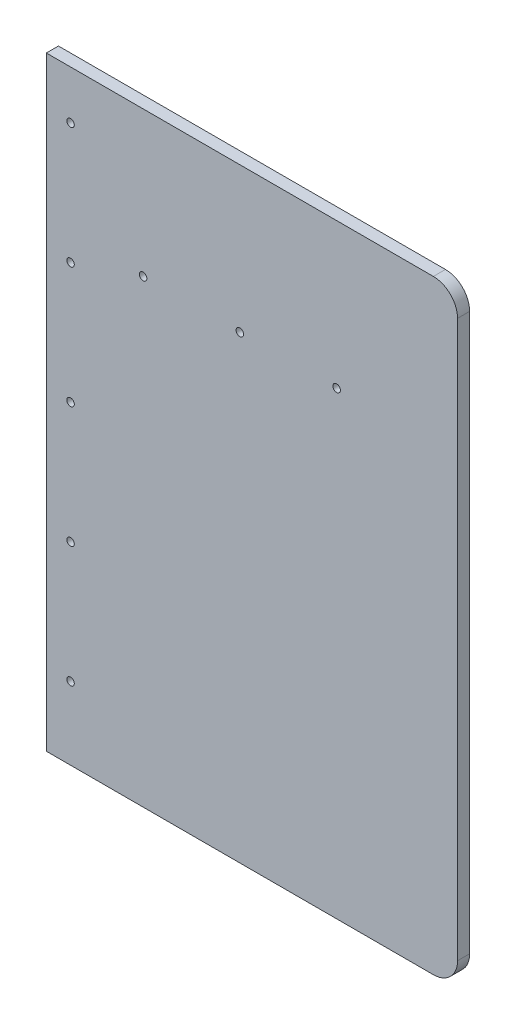
ISO-10303-21;
HEADER;
FILE_DESCRIPTION(('STEP AP214'),'2;1');
FILE_NAME('part.step','',(''),(''),'','','');
FILE_SCHEMA(('AUTOMOTIVE_DESIGN { 1 0 10303 214 1 1 1 1 }'));
ENDSEC;
DATA;
#1=APPLICATION_CONTEXT('core data for automotive mechanical design processes');
#2=APPLICATION_PROTOCOL_DEFINITION('international standard','automotive_design',2000,#1);
#3=PRODUCT_CONTEXT('',#1,'mechanical');
#4=PRODUCT('Part','Part','',(#3));
#5=PRODUCT_RELATED_PRODUCT_CATEGORY('part','',(#4));
#6=PRODUCT_DEFINITION_FORMATION('','',#4);
#7=PRODUCT_DEFINITION_CONTEXT('part definition',#1,'design');
#8=PRODUCT_DEFINITION('design','',#6,#7);
#9=PRODUCT_DEFINITION_SHAPE('','',#8);
#10=(LENGTH_UNIT() NAMED_UNIT(*) SI_UNIT(.MILLI.,.METRE.));
#11=(NAMED_UNIT(*) PLANE_ANGLE_UNIT() SI_UNIT($,.RADIAN.));
#12=(NAMED_UNIT(*) SI_UNIT($,.STERADIAN.) SOLID_ANGLE_UNIT());
#13=UNCERTAINTY_MEASURE_WITH_UNIT(LENGTH_MEASURE(1.E-05),#10,'distance_accuracy_value','');
#14=(GEOMETRIC_REPRESENTATION_CONTEXT(3) GLOBAL_UNCERTAINTY_ASSIGNED_CONTEXT((#13)) GLOBAL_UNIT_ASSIGNED_CONTEXT((#10,
#11,#12)) REPRESENTATION_CONTEXT('',''));
#15=CARTESIAN_POINT('',(0.,0.,0.));
#16=DIRECTION('',(0.,0.,1.));
#17=DIRECTION('',(1.,0.,0.));
#18=AXIS2_PLACEMENT_3D('',#15,#16,#17);
#19=CARTESIAN_POINT('',(75.,-115.,5.));
#20=DIRECTION('',(0.,0.,1.));
#21=DIRECTION('',(1.,0.,0.));
#22=AXIS2_PLACEMENT_3D('',#19,#20,#21);
#23=PLANE('',#22);
#24=CARTESIAN_POINT('',(-5.00000000000002,64.9999999999991,5.));
#25=DIRECTION('',(0.,0.,1.));
#26=DIRECTION('',(1.,0.,0.));
#27=AXIS2_PLACEMENT_3D('',#24,#25,#26);
#28=CIRCLE('',#27,1.55);
#29=CARTESIAN_POINT('',(-3.45000000000002,64.9999999999991,5.));
#30=VERTEX_POINT('',#29);
#31=EDGE_CURVE('E206',#30,#30,#28,.T.);
#32=ORIENTED_EDGE('',*,*,#31,.F.);
#33=EDGE_LOOP('',(#32));
#34=FACE_BOUND('',#33,.T.);
#35=CARTESIAN_POINT('',(-74.9999999999985,-45.,5.));
#36=DIRECTION('',(0.,0.,1.));
#37=DIRECTION('',(1.,0.,0.));
#38=AXIS2_PLACEMENT_3D('',#35,#36,#37);
#39=CIRCLE('',#38,1.54999999999999);
#40=CARTESIAN_POINT('',(-73.4499999999985,-45.,5.));
#41=VERTEX_POINT('',#40);
#42=EDGE_CURVE('E218',#41,#41,#39,.T.);
#43=ORIENTED_EDGE('',*,*,#42,.F.);
#44=EDGE_LOOP('',(#43));
#45=FACE_BOUND('',#44,.T.);
#46=CARTESIAN_POINT('',(-74.9999999999995,55.,5.));
#47=DIRECTION('',(0.,0.,1.));
#48=DIRECTION('',(1.,0.,0.));
#49=AXIS2_PLACEMENT_3D('',#46,#47,#48);
#50=CIRCLE('',#49,1.54999999999999);
#51=CARTESIAN_POINT('',(-73.4499999999995,55.,5.));
#52=VERTEX_POINT('',#51);
#53=EDGE_CURVE('E230',#52,#52,#50,.T.);
#54=ORIENTED_EDGE('',*,*,#53,.F.);
#55=EDGE_LOOP('',(#54));
#56=FACE_BOUND('',#55,.T.);
#57=CARTESIAN_POINT('',(35.,64.9999999999999,5.));
#58=DIRECTION('',(0.,0.,1.));
#59=DIRECTION('',(1.,0.,0.));
#60=AXIS2_PLACEMENT_3D('',#57,#58,#59);
#61=CIRCLE('',#60,1.54999999999999);
#62=CARTESIAN_POINT('',(36.55,64.9999999999999,5.));
#63=VERTEX_POINT('',#62);
#64=EDGE_CURVE('E123',#63,#63,#61,.T.);
#65=ORIENTED_EDGE('',*,*,#64,.F.);
#66=EDGE_LOOP('',(#65));
#67=FACE_BOUND('',#66,.T.);
#68=DIRECTION('',(0.,-1.,0.));
#69=VECTOR('',#68,1.);
#70=CARTESIAN_POINT('',(-85.,125.,5.));
#71=LINE('',#70,#69);
#72=CARTESIAN_POINT('',(-85.,125.,5.));
#73=VERTEX_POINT('',#72);
#74=CARTESIAN_POINT('',(-85.,-125.,5.));
#75=VERTEX_POINT('',#74);
#76=EDGE_CURVE('E130',#73,#75,#71,.T.);
#77=ORIENTED_EDGE('',*,*,#76,.T.);
#78=DIRECTION('',(1.,0.,0.));
#79=VECTOR('',#78,1.);
#80=CARTESIAN_POINT('',(75.,-125.,5.));
#81=LINE('',#80,#79);
#82=CARTESIAN_POINT('',(75.,-125.,5.));
#83=VERTEX_POINT('',#82);
#84=EDGE_CURVE('E88',#75,#83,#81,.T.);
#85=ORIENTED_EDGE('',*,*,#84,.T.);
#86=CARTESIAN_POINT('',(75.,-115.,5.));
#87=DIRECTION('',(0.,0.,1.));
#88=DIRECTION('',(1.,0.,0.));
#89=AXIS2_PLACEMENT_3D('',#86,#87,#88);
#90=CIRCLE('',#89,9.99999999999999);
#91=CARTESIAN_POINT('',(85.,-115.,5.));
#92=VERTEX_POINT('',#91);
#93=EDGE_CURVE('E101',#83,#92,#90,.T.);
#94=ORIENTED_EDGE('',*,*,#93,.T.);
#95=DIRECTION('',(0.,1.,0.));
#96=VECTOR('',#95,1.);
#97=CARTESIAN_POINT('',(85.,115.,5.));
#98=LINE('',#97,#96);
#99=CARTESIAN_POINT('',(85.,115.,5.));
#100=VERTEX_POINT('',#99);
#101=EDGE_CURVE('E95',#92,#100,#98,.T.);
#102=ORIENTED_EDGE('',*,*,#101,.T.);
#103=CARTESIAN_POINT('',(75.,115.,5.));
#104=DIRECTION('',(0.,0.,1.));
#105=DIRECTION('',(1.,0.,0.));
#106=AXIS2_PLACEMENT_3D('',#103,#104,#105);
#107=CIRCLE('',#106,9.99999999999999);
#108=CARTESIAN_POINT('',(75.,125.,5.));
#109=VERTEX_POINT('',#108);
#110=EDGE_CURVE('E99',#100,#109,#107,.T.);
#111=ORIENTED_EDGE('',*,*,#110,.T.);
#112=DIRECTION('',(-1.,0.,0.));
#113=VECTOR('',#112,1.);
#114=CARTESIAN_POINT('',(75.,125.,5.));
#115=LINE('',#114,#113);
#116=EDGE_CURVE('E51',#109,#73,#115,.T.);
#117=ORIENTED_EDGE('',*,*,#116,.T.);
#118=EDGE_LOOP('',(#77,#85,#94,#102,#111,#117));
#119=FACE_BOUND('',#118,.T.);
#120=CARTESIAN_POINT('',(-75.,105.,5.));
#121=DIRECTION('',(0.,0.,1.));
#122=DIRECTION('',(1.,0.,0.));
#123=AXIS2_PLACEMENT_3D('',#120,#121,#122);
#124=CIRCLE('',#123,1.54999999999999);
#125=CARTESIAN_POINT('',(-73.45,105.,5.));
#126=VERTEX_POINT('',#125);
#127=EDGE_CURVE('E236',#126,#126,#124,.T.);
#128=ORIENTED_EDGE('',*,*,#127,.F.);
#129=EDGE_LOOP('',(#128));
#130=FACE_BOUND('',#129,.T.);
#131=CARTESIAN_POINT('',(-74.999999999999,4.99999999999996,5.));
#132=DIRECTION('',(0.,0.,1.));
#133=DIRECTION('',(1.,0.,0.));
#134=AXIS2_PLACEMENT_3D('',#131,#132,#133);
#135=CIRCLE('',#134,1.54999999999999);
#136=CARTESIAN_POINT('',(-73.449999999999,4.99999999999996,5.));
#137=VERTEX_POINT('',#136);
#138=EDGE_CURVE('E224',#137,#137,#135,.T.);
#139=ORIENTED_EDGE('',*,*,#138,.F.);
#140=EDGE_LOOP('',(#139));
#141=FACE_BOUND('',#140,.T.);
#142=CARTESIAN_POINT('',(-74.9999999999979,-95.,5.));
#143=DIRECTION('',(0.,0.,1.));
#144=DIRECTION('',(1.,0.,0.));
#145=AXIS2_PLACEMENT_3D('',#142,#143,#144);
#146=CIRCLE('',#145,1.54999999999999);
#147=CARTESIAN_POINT('',(-73.4499999999979,-95.,5.));
#148=VERTEX_POINT('',#147);
#149=EDGE_CURVE('E212',#148,#148,#146,.T.);
#150=ORIENTED_EDGE('',*,*,#149,.F.);
#151=EDGE_LOOP('',(#150));
#152=FACE_BOUND('',#151,.T.);
#153=CARTESIAN_POINT('',(-45.,64.9999999999983,5.));
#154=DIRECTION('',(0.,0.,1.));
#155=DIRECTION('',(1.,0.,0.));
#156=AXIS2_PLACEMENT_3D('',#153,#154,#155);
#157=CIRCLE('',#156,1.54999999999999);
#158=CARTESIAN_POINT('',(-43.45,64.9999999999983,5.));
#159=VERTEX_POINT('',#158);
#160=EDGE_CURVE('E197',#159,#159,#157,.T.);
#161=ORIENTED_EDGE('',*,*,#160,.F.);
#162=EDGE_LOOP('',(#161));
#163=FACE_BOUND('',#162,.T.);
#164=ADVANCED_FACE('F34',(#34,#45,#56,#67,#119,#130,#141,#152,#163),#23,.T.);
#165=CARTESIAN_POINT('',(75.,-115.,0.));
#166=DIRECTION('',(0.,0.,1.));
#167=DIRECTION('',(1.,0.,0.));
#168=AXIS2_PLACEMENT_3D('',#165,#166,#167);
#169=PLANE('',#168);
#170=DIRECTION('',(0.,-1.,0.));
#171=VECTOR('',#170,1.);
#172=CARTESIAN_POINT('',(-85.,125.,0.));
#173=LINE('',#172,#171);
#174=CARTESIAN_POINT('',(-85.,125.,0.));
#175=VERTEX_POINT('',#174);
#176=CARTESIAN_POINT('',(-85.,-125.,0.));
#177=VERTEX_POINT('',#176);
#178=EDGE_CURVE('E119',#175,#177,#173,.T.);
#179=ORIENTED_EDGE('',*,*,#178,.F.);
#180=DIRECTION('',(-1.,0.,0.));
#181=VECTOR('',#180,1.);
#182=CARTESIAN_POINT('',(75.,125.,0.));
#183=LINE('',#182,#181);
#184=CARTESIAN_POINT('',(75.,125.,0.));
#185=VERTEX_POINT('',#184);
#186=EDGE_CURVE('E80',#185,#175,#183,.T.);
#187=ORIENTED_EDGE('',*,*,#186,.F.);
#188=CARTESIAN_POINT('',(75.,115.,0.));
#189=DIRECTION('',(0.,0.,1.));
#190=DIRECTION('',(1.,0.,0.));
#191=AXIS2_PLACEMENT_3D('',#188,#189,#190);
#192=CIRCLE('',#191,9.99999999999999);
#193=CARTESIAN_POINT('',(85.,115.,0.));
#194=VERTEX_POINT('',#193);
#195=EDGE_CURVE('E74',#194,#185,#192,.T.);
#196=ORIENTED_EDGE('',*,*,#195,.F.);
#197=DIRECTION('',(0.,1.,0.));
#198=VECTOR('',#197,1.);
#199=CARTESIAN_POINT('',(85.,115.,0.));
#200=LINE('',#199,#198);
#201=CARTESIAN_POINT('',(85.,-115.,0.));
#202=VERTEX_POINT('',#201);
#203=EDGE_CURVE('E109',#202,#194,#200,.T.);
#204=ORIENTED_EDGE('',*,*,#203,.F.);
#205=CARTESIAN_POINT('',(75.,-115.,0.));
#206=DIRECTION('',(0.,0.,1.));
#207=DIRECTION('',(1.,0.,0.));
#208=AXIS2_PLACEMENT_3D('',#205,#206,#207);
#209=CIRCLE('',#208,9.99999999999999);
#210=CARTESIAN_POINT('',(75.,-125.,0.));
#211=VERTEX_POINT('',#210);
#212=EDGE_CURVE('E125',#211,#202,#209,.T.);
#213=ORIENTED_EDGE('',*,*,#212,.F.);
#214=DIRECTION('',(1.,0.,0.));
#215=VECTOR('',#214,1.);
#216=CARTESIAN_POINT('',(75.,-125.,0.));
#217=LINE('',#216,#215);
#218=EDGE_CURVE('E122',#177,#211,#217,.T.);
#219=ORIENTED_EDGE('',*,*,#218,.F.);
#220=EDGE_LOOP('',(#179,#187,#196,#204,#213,#219));
#221=FACE_BOUND('',#220,.T.);
#222=CARTESIAN_POINT('',(35.,64.9999999999999,0.));
#223=DIRECTION('',(0.,0.,1.));
#224=DIRECTION('',(1.,0.,0.));
#225=AXIS2_PLACEMENT_3D('',#222,#223,#224);
#226=CIRCLE('',#225,1.54999999999999);
#227=CARTESIAN_POINT('',(36.55,64.9999999999999,0.));
#228=VERTEX_POINT('',#227);
#229=EDGE_CURVE('E239',#228,#228,#226,.T.);
#230=ORIENTED_EDGE('',*,*,#229,.T.);
#231=EDGE_LOOP('',(#230));
#232=FACE_BOUND('',#231,.T.);
#233=CARTESIAN_POINT('',(-75.,105.,0.));
#234=DIRECTION('',(0.,0.,1.));
#235=DIRECTION('',(1.,0.,0.));
#236=AXIS2_PLACEMENT_3D('',#233,#234,#235);
#237=CIRCLE('',#236,1.54999999999999);
#238=CARTESIAN_POINT('',(-73.45,105.,0.));
#239=VERTEX_POINT('',#238);
#240=EDGE_CURVE('E233',#239,#239,#237,.T.);
#241=ORIENTED_EDGE('',*,*,#240,.T.);
#242=EDGE_LOOP('',(#241));
#243=FACE_BOUND('',#242,.T.);
#244=CARTESIAN_POINT('',(-74.9999999999995,55.,0.));
#245=DIRECTION('',(0.,0.,1.));
#246=DIRECTION('',(1.,0.,0.));
#247=AXIS2_PLACEMENT_3D('',#244,#245,#246);
#248=CIRCLE('',#247,1.54999999999999);
#249=CARTESIAN_POINT('',(-73.4499999999995,55.,0.));
#250=VERTEX_POINT('',#249);
#251=EDGE_CURVE('E227',#250,#250,#248,.T.);
#252=ORIENTED_EDGE('',*,*,#251,.T.);
#253=EDGE_LOOP('',(#252));
#254=FACE_BOUND('',#253,.T.);
#255=CARTESIAN_POINT('',(-74.999999999999,4.99999999999996,0.));
#256=DIRECTION('',(0.,0.,1.));
#257=DIRECTION('',(1.,0.,0.));
#258=AXIS2_PLACEMENT_3D('',#255,#256,#257);
#259=CIRCLE('',#258,1.54999999999999);
#260=CARTESIAN_POINT('',(-73.449999999999,4.99999999999996,0.));
#261=VERTEX_POINT('',#260);
#262=EDGE_CURVE('E221',#261,#261,#259,.T.);
#263=ORIENTED_EDGE('',*,*,#262,.T.);
#264=EDGE_LOOP('',(#263));
#265=FACE_BOUND('',#264,.T.);
#266=CARTESIAN_POINT('',(-74.9999999999985,-45.,0.));
#267=DIRECTION('',(0.,0.,1.));
#268=DIRECTION('',(1.,0.,0.));
#269=AXIS2_PLACEMENT_3D('',#266,#267,#268);
#270=CIRCLE('',#269,1.54999999999999);
#271=CARTESIAN_POINT('',(-73.4499999999985,-45.,0.));
#272=VERTEX_POINT('',#271);
#273=EDGE_CURVE('E215',#272,#272,#270,.T.);
#274=ORIENTED_EDGE('',*,*,#273,.T.);
#275=EDGE_LOOP('',(#274));
#276=FACE_BOUND('',#275,.T.);
#277=CARTESIAN_POINT('',(-74.9999999999979,-95.,0.));
#278=DIRECTION('',(0.,0.,1.));
#279=DIRECTION('',(1.,0.,0.));
#280=AXIS2_PLACEMENT_3D('',#277,#278,#279);
#281=CIRCLE('',#280,1.54999999999999);
#282=CARTESIAN_POINT('',(-73.4499999999979,-95.,0.));
#283=VERTEX_POINT('',#282);
#284=EDGE_CURVE('E209',#283,#283,#281,.T.);
#285=ORIENTED_EDGE('',*,*,#284,.T.);
#286=EDGE_LOOP('',(#285));
#287=FACE_BOUND('',#286,.T.);
#288=CARTESIAN_POINT('',(-5.00000000000002,64.9999999999991,0.));
#289=DIRECTION('',(0.,0.,1.));
#290=DIRECTION('',(1.,0.,0.));
#291=AXIS2_PLACEMENT_3D('',#288,#289,#290);
#292=CIRCLE('',#291,1.55);
#293=CARTESIAN_POINT('',(-3.45000000000002,64.9999999999991,0.));
#294=VERTEX_POINT('',#293);
#295=EDGE_CURVE('E203',#294,#294,#292,.T.);
#296=ORIENTED_EDGE('',*,*,#295,.T.);
#297=EDGE_LOOP('',(#296));
#298=FACE_BOUND('',#297,.T.);
#299=CARTESIAN_POINT('',(-45.,64.9999999999983,0.));
#300=DIRECTION('',(0.,0.,1.));
#301=DIRECTION('',(1.,0.,0.));
#302=AXIS2_PLACEMENT_3D('',#299,#300,#301);
#303=CIRCLE('',#302,1.54999999999999);
#304=CARTESIAN_POINT('',(-43.45,64.9999999999983,0.));
#305=VERTEX_POINT('',#304);
#306=EDGE_CURVE('E200',#305,#305,#303,.T.);
#307=ORIENTED_EDGE('',*,*,#306,.T.);
#308=EDGE_LOOP('',(#307));
#309=FACE_BOUND('',#308,.T.);
#310=ADVANCED_FACE('F139',(#221,#232,#243,#254,#265,#276,#287,#298,#309),#169,.F.);
#311=CARTESIAN_POINT('',(-85.,125.,5.));
#312=DIRECTION('',(1.,0.,0.));
#313=DIRECTION('',(0.,1.,0.));
#314=AXIS2_PLACEMENT_3D('',#311,#312,#313);
#315=PLANE('',#314);
#316=ORIENTED_EDGE('',*,*,#178,.T.);
#317=DIRECTION('',(0.,0.,-1.));
#318=VECTOR('',#317,1.);
#319=CARTESIAN_POINT('',(-85.,-125.,5.));
#320=LINE('',#319,#318);
#321=EDGE_CURVE('E11',#75,#177,#320,.T.);
#322=ORIENTED_EDGE('',*,*,#321,.F.);
#323=ORIENTED_EDGE('',*,*,#76,.F.);
#324=DIRECTION('',(0.,0.,-1.));
#325=VECTOR('',#324,1.);
#326=CARTESIAN_POINT('',(-85.,125.,5.));
#327=LINE('',#326,#325);
#328=EDGE_CURVE('E115',#73,#175,#327,.T.);
#329=ORIENTED_EDGE('',*,*,#328,.T.);
#330=EDGE_LOOP('',(#316,#322,#323,#329));
#331=FACE_BOUND('',#330,.T.);
#332=ADVANCED_FACE('F36',(#331),#315,.F.);
#333=CARTESIAN_POINT('',(75.,-125.,5.));
#334=DIRECTION('',(0.,1.,0.));
#335=DIRECTION('',(0.,0.,1.));
#336=AXIS2_PLACEMENT_3D('',#333,#334,#335);
#337=PLANE('',#336);
#338=ORIENTED_EDGE('',*,*,#218,.T.);
#339=DIRECTION('',(0.,0.,-1.));
#340=VECTOR('',#339,1.);
#341=CARTESIAN_POINT('',(75.,-125.,5.));
#342=LINE('',#341,#340);
#343=EDGE_CURVE('E43',#83,#211,#342,.T.);
#344=ORIENTED_EDGE('',*,*,#343,.F.);
#345=ORIENTED_EDGE('',*,*,#84,.F.);
#346=ORIENTED_EDGE('',*,*,#321,.T.);
#347=EDGE_LOOP('',(#338,#344,#345,#346));
#348=FACE_BOUND('',#347,.T.);
#349=ADVANCED_FACE('F333',(#348),#337,.F.);
#350=CARTESIAN_POINT('',(75.,-115.,5.));
#351=DIRECTION('',(0.,0.,-1.));
#352=DIRECTION('',(-1.,0.,0.));
#353=AXIS2_PLACEMENT_3D('',#350,#351,#352);
#354=CYLINDRICAL_SURFACE('',#353,9.99999999999999);
#355=ORIENTED_EDGE('',*,*,#212,.T.);
#356=DIRECTION('',(0.,0.,-1.));
#357=VECTOR('',#356,1.);
#358=CARTESIAN_POINT('',(85.,-115.,5.));
#359=LINE('',#358,#357);
#360=EDGE_CURVE('E110',#92,#202,#359,.T.);
#361=ORIENTED_EDGE('',*,*,#360,.F.);
#362=ORIENTED_EDGE('',*,*,#93,.F.);
#363=ORIENTED_EDGE('',*,*,#343,.T.);
#364=EDGE_LOOP('',(#355,#361,#362,#363));
#365=FACE_BOUND('',#364,.T.);
#366=ADVANCED_FACE('F136',(#365),#354,.T.);
#367=CARTESIAN_POINT('',(85.,115.,5.));
#368=DIRECTION('',(-1.,0.,0.));
#369=DIRECTION('',(0.,-1.,0.));
#370=AXIS2_PLACEMENT_3D('',#367,#368,#369);
#371=PLANE('',#370);
#372=ORIENTED_EDGE('',*,*,#203,.T.);
#373=DIRECTION('',(0.,0.,-1.));
#374=VECTOR('',#373,1.);
#375=CARTESIAN_POINT('',(85.,115.,5.));
#376=LINE('',#375,#374);
#377=EDGE_CURVE('E106',#100,#194,#376,.T.);
#378=ORIENTED_EDGE('',*,*,#377,.F.);
#379=ORIENTED_EDGE('',*,*,#101,.F.);
#380=ORIENTED_EDGE('',*,*,#360,.T.);
#381=EDGE_LOOP('',(#372,#378,#379,#380));
#382=FACE_BOUND('',#381,.T.);
#383=ADVANCED_FACE('F107',(#382),#371,.F.);
#384=CARTESIAN_POINT('',(75.,115.,5.));
#385=DIRECTION('',(0.,0.,-1.));
#386=DIRECTION('',(-1.,0.,0.));
#387=AXIS2_PLACEMENT_3D('',#384,#385,#386);
#388=CYLINDRICAL_SURFACE('',#387,9.99999999999999);
#389=ORIENTED_EDGE('',*,*,#195,.T.);
#390=DIRECTION('',(0.,0.,-1.));
#391=VECTOR('',#390,1.);
#392=CARTESIAN_POINT('',(75.,125.,5.));
#393=LINE('',#392,#391);
#394=EDGE_CURVE('E111',#109,#185,#393,.T.);
#395=ORIENTED_EDGE('',*,*,#394,.F.);
#396=ORIENTED_EDGE('',*,*,#110,.F.);
#397=ORIENTED_EDGE('',*,*,#377,.T.);
#398=EDGE_LOOP('',(#389,#395,#396,#397));
#399=FACE_BOUND('',#398,.T.);
#400=ADVANCED_FACE('F113',(#399),#388,.T.);
#401=CARTESIAN_POINT('',(75.,125.,5.));
#402=DIRECTION('',(0.,-1.,0.));
#403=DIRECTION('',(1.,0.,0.));
#404=AXIS2_PLACEMENT_3D('',#401,#402,#403);
#405=PLANE('',#404);
#406=ORIENTED_EDGE('',*,*,#186,.T.);
#407=ORIENTED_EDGE('',*,*,#328,.F.);
#408=ORIENTED_EDGE('',*,*,#116,.F.);
#409=ORIENTED_EDGE('',*,*,#394,.T.);
#410=EDGE_LOOP('',(#406,#407,#408,#409));
#411=FACE_BOUND('',#410,.T.);
#412=ADVANCED_FACE('F144',(#411),#405,.F.);
#413=CARTESIAN_POINT('',(35.,64.9999999999999,5.));
#414=DIRECTION('',(0.,0.,-1.));
#415=DIRECTION('',(-1.,0.,0.));
#416=AXIS2_PLACEMENT_3D('',#413,#414,#415);
#417=CYLINDRICAL_SURFACE('',#416,1.54999999999999);
#418=ORIENTED_EDGE('',*,*,#64,.T.);
#419=EDGE_LOOP('',(#418));
#420=FACE_BOUND('',#419,.T.);
#421=ORIENTED_EDGE('',*,*,#229,.F.);
#422=EDGE_LOOP('',(#421));
#423=FACE_BOUND('',#422,.T.);
#424=ADVANCED_FACE('F146',(#420,#423),#417,.F.);
#425=CARTESIAN_POINT('',(-75.,105.,5.));
#426=DIRECTION('',(0.,0.,-1.));
#427=DIRECTION('',(-1.,0.,0.));
#428=AXIS2_PLACEMENT_3D('',#425,#426,#427);
#429=CYLINDRICAL_SURFACE('',#428,1.54999999999999);
#430=ORIENTED_EDGE('',*,*,#127,.T.);
#431=EDGE_LOOP('',(#430));
#432=FACE_BOUND('',#431,.T.);
#433=ORIENTED_EDGE('',*,*,#240,.F.);
#434=EDGE_LOOP('',(#433));
#435=FACE_BOUND('',#434,.T.);
#436=ADVANCED_FACE('F152',(#432,#435),#429,.F.);
#437=CARTESIAN_POINT('',(-74.9999999999995,55.,5.));
#438=DIRECTION('',(0.,0.,-1.));
#439=DIRECTION('',(-1.,0.,0.));
#440=AXIS2_PLACEMENT_3D('',#437,#438,#439);
#441=CYLINDRICAL_SURFACE('',#440,1.54999999999999);
#442=ORIENTED_EDGE('',*,*,#53,.T.);
#443=EDGE_LOOP('',(#442));
#444=FACE_BOUND('',#443,.T.);
#445=ORIENTED_EDGE('',*,*,#251,.F.);
#446=EDGE_LOOP('',(#445));
#447=FACE_BOUND('',#446,.T.);
#448=ADVANCED_FACE('F168',(#444,#447),#441,.F.);
#449=CARTESIAN_POINT('',(-74.999999999999,4.99999999999996,5.));
#450=DIRECTION('',(0.,0.,-1.));
#451=DIRECTION('',(-1.,0.,0.));
#452=AXIS2_PLACEMENT_3D('',#449,#450,#451);
#453=CYLINDRICAL_SURFACE('',#452,1.54999999999999);
#454=ORIENTED_EDGE('',*,*,#138,.T.);
#455=EDGE_LOOP('',(#454));
#456=FACE_BOUND('',#455,.T.);
#457=ORIENTED_EDGE('',*,*,#262,.F.);
#458=EDGE_LOOP('',(#457));
#459=FACE_BOUND('',#458,.T.);
#460=ADVANCED_FACE('F172',(#456,#459),#453,.F.);
#461=CARTESIAN_POINT('',(-74.9999999999985,-45.,5.));
#462=DIRECTION('',(0.,0.,-1.));
#463=DIRECTION('',(-1.,0.,0.));
#464=AXIS2_PLACEMENT_3D('',#461,#462,#463);
#465=CYLINDRICAL_SURFACE('',#464,1.54999999999999);
#466=ORIENTED_EDGE('',*,*,#42,.T.);
#467=EDGE_LOOP('',(#466));
#468=FACE_BOUND('',#467,.T.);
#469=ORIENTED_EDGE('',*,*,#273,.F.);
#470=EDGE_LOOP('',(#469));
#471=FACE_BOUND('',#470,.T.);
#472=ADVANCED_FACE('F176',(#468,#471),#465,.F.);
#473=CARTESIAN_POINT('',(-74.9999999999979,-95.,5.));
#474=DIRECTION('',(0.,0.,-1.));
#475=DIRECTION('',(-1.,0.,0.));
#476=AXIS2_PLACEMENT_3D('',#473,#474,#475);
#477=CYLINDRICAL_SURFACE('',#476,1.54999999999999);
#478=ORIENTED_EDGE('',*,*,#149,.T.);
#479=EDGE_LOOP('',(#478));
#480=FACE_BOUND('',#479,.T.);
#481=ORIENTED_EDGE('',*,*,#284,.F.);
#482=EDGE_LOOP('',(#481));
#483=FACE_BOUND('',#482,.T.);
#484=ADVANCED_FACE('F180',(#480,#483),#477,.F.);
#485=CARTESIAN_POINT('',(-5.00000000000002,64.9999999999991,5.));
#486=DIRECTION('',(0.,0.,-1.));
#487=DIRECTION('',(-1.,0.,0.));
#488=AXIS2_PLACEMENT_3D('',#485,#486,#487);
#489=CYLINDRICAL_SURFACE('',#488,1.55);
#490=ORIENTED_EDGE('',*,*,#31,.T.);
#491=EDGE_LOOP('',(#490));
#492=FACE_BOUND('',#491,.T.);
#493=ORIENTED_EDGE('',*,*,#295,.F.);
#494=EDGE_LOOP('',(#493));
#495=FACE_BOUND('',#494,.T.);
#496=ADVANCED_FACE('F184',(#492,#495),#489,.F.);
#497=CARTESIAN_POINT('',(-45.,64.9999999999983,5.));
#498=DIRECTION('',(0.,0.,-1.));
#499=DIRECTION('',(-1.,0.,0.));
#500=AXIS2_PLACEMENT_3D('',#497,#498,#499);
#501=CYLINDRICAL_SURFACE('',#500,1.54999999999999);
#502=ORIENTED_EDGE('',*,*,#160,.T.);
#503=EDGE_LOOP('',(#502));
#504=FACE_BOUND('',#503,.T.);
#505=ORIENTED_EDGE('',*,*,#306,.F.);
#506=EDGE_LOOP('',(#505));
#507=FACE_BOUND('',#506,.T.);
#508=ADVANCED_FACE('F188',(#504,#507),#501,.F.);
#509=CLOSED_SHELL('',(#164,#310,#332,#349,#366,#383,#400,#412,#424,#436,#448,#460,#472,#484,
#496,#508));
#510=MANIFOLD_SOLID_BREP('B2',#509);
#511=ADVANCED_BREP_SHAPE_REPRESENTATION('',(#18,#510),#14);
#512=SHAPE_DEFINITION_REPRESENTATION(#9,#511);
ENDSEC;
END-ISO-10303-21;
